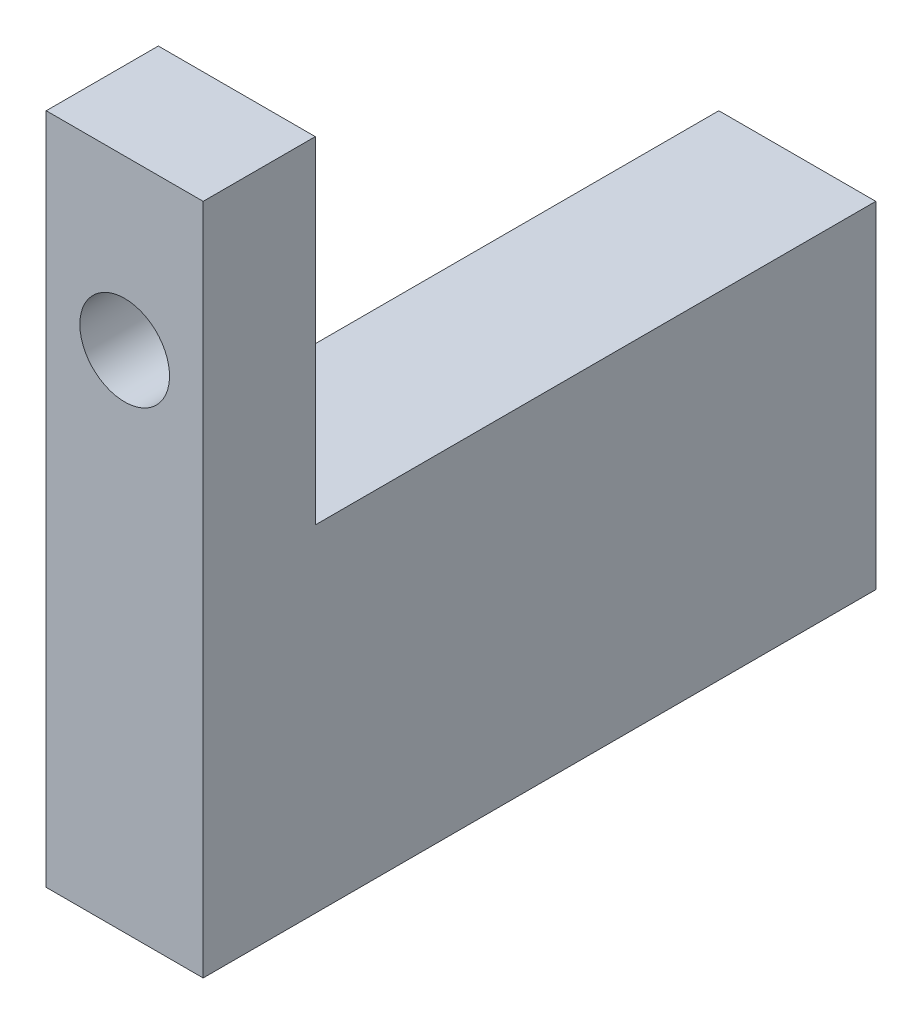
ISO-10303-21;
HEADER;
FILE_DESCRIPTION(('STEP AP214'),'2;1');
FILE_NAME('part.step','',(''),(''),'','','');
FILE_SCHEMA(('AUTOMOTIVE_DESIGN { 1 0 10303 214 1 1 1 1 }'));
ENDSEC;
DATA;
#1=APPLICATION_CONTEXT('core data for automotive mechanical design processes');
#2=APPLICATION_PROTOCOL_DEFINITION('international standard','automotive_design',2000,#1);
#3=PRODUCT_CONTEXT('',#1,'mechanical');
#4=PRODUCT('Part','Part','',(#3));
#5=PRODUCT_RELATED_PRODUCT_CATEGORY('part','',(#4));
#6=PRODUCT_DEFINITION_FORMATION('','',#4);
#7=PRODUCT_DEFINITION_CONTEXT('part definition',#1,'design');
#8=PRODUCT_DEFINITION('design','',#6,#7);
#9=PRODUCT_DEFINITION_SHAPE('','',#8);
#10=(LENGTH_UNIT() NAMED_UNIT(*) SI_UNIT(.MILLI.,.METRE.));
#11=(NAMED_UNIT(*) PLANE_ANGLE_UNIT() SI_UNIT($,.RADIAN.));
#12=(NAMED_UNIT(*) SI_UNIT($,.STERADIAN.) SOLID_ANGLE_UNIT());
#13=UNCERTAINTY_MEASURE_WITH_UNIT(LENGTH_MEASURE(1.E-05),#10,'distance_accuracy_value','');
#14=(GEOMETRIC_REPRESENTATION_CONTEXT(3) GLOBAL_UNCERTAINTY_ASSIGNED_CONTEXT((#13)) GLOBAL_UNIT_ASSIGNED_CONTEXT((#10,
#11,#12)) REPRESENTATION_CONTEXT('',''));
#15=CARTESIAN_POINT('',(0.,0.,0.));
#16=DIRECTION('',(0.,0.,1.));
#17=DIRECTION('',(1.,0.,0.));
#18=AXIS2_PLACEMENT_3D('',#15,#16,#17);
#19=CARTESIAN_POINT('',(7.,30.,0.));
#20=DIRECTION('',(0.,0.,-1.));
#21=DIRECTION('',(0.,1.,0.));
#22=AXIS2_PLACEMENT_3D('',#19,#20,#21);
#23=PLANE('',#22);
#24=CARTESIAN_POINT('',(3.5,22.5,0.));
#25=DIRECTION('',(0.,0.,-1.));
#26=DIRECTION('',(0.,1.,0.));
#27=AXIS2_PLACEMENT_3D('',#24,#25,#26);
#28=CIRCLE('',#27,2.);
#29=CARTESIAN_POINT('',(3.5,24.5,0.));
#30=VERTEX_POINT('',#29);
#31=EDGE_CURVE('E121',#30,#30,#28,.T.);
#32=ORIENTED_EDGE('',*,*,#31,.T.);
#33=EDGE_LOOP('',(#32));
#34=FACE_BOUND('',#33,.T.);
#35=DIRECTION('',(0.,-1.,0.));
#36=VECTOR('',#35,1.);
#37=CARTESIAN_POINT('',(0.,30.,0.));
#38=LINE('',#37,#36);
#39=CARTESIAN_POINT('',(0.,30.,0.));
#40=VERTEX_POINT('',#39);
#41=CARTESIAN_POINT('',(0.,0.,0.));
#42=VERTEX_POINT('',#41);
#43=EDGE_CURVE('E117',#40,#42,#38,.T.);
#44=ORIENTED_EDGE('',*,*,#43,.T.);
#45=DIRECTION('',(-1.,0.,0.));
#46=VECTOR('',#45,1.);
#47=CARTESIAN_POINT('',(7.,0.,0.));
#48=LINE('',#47,#46);
#49=CARTESIAN_POINT('',(7.,0.,0.));
#50=VERTEX_POINT('',#49);
#51=EDGE_CURVE('E11',#50,#42,#48,.T.);
#52=ORIENTED_EDGE('',*,*,#51,.F.);
#53=DIRECTION('',(0.,-1.,0.));
#54=VECTOR('',#53,1.);
#55=CARTESIAN_POINT('',(7.,30.,0.));
#56=LINE('',#55,#54);
#57=CARTESIAN_POINT('',(7.,30.,0.));
#58=VERTEX_POINT('',#57);
#59=EDGE_CURVE('E128',#58,#50,#56,.T.);
#60=ORIENTED_EDGE('',*,*,#59,.F.);
#61=DIRECTION('',(-1.,0.,0.));
#62=VECTOR('',#61,1.);
#63=CARTESIAN_POINT('',(7.,30.,0.));
#64=LINE('',#63,#62);
#65=EDGE_CURVE('E113',#58,#40,#64,.T.);
#66=ORIENTED_EDGE('',*,*,#65,.T.);
#67=EDGE_LOOP('',(#44,#52,#60,#66));
#68=FACE_BOUND('',#67,.T.);
#69=ADVANCED_FACE('F33',(#34,#68),#23,.F.);
#70=CARTESIAN_POINT('',(7.,0.,0.));
#71=DIRECTION('',(0.,1.,0.));
#72=DIRECTION('',(0.,0.,1.));
#73=AXIS2_PLACEMENT_3D('',#70,#71,#72);
#74=PLANE('',#73);
#75=DIRECTION('',(0.,0.,-1.));
#76=VECTOR('',#75,1.);
#77=CARTESIAN_POINT('',(0.,0.,0.));
#78=LINE('',#77,#76);
#79=CARTESIAN_POINT('',(0.,0.,-30.));
#80=VERTEX_POINT('',#79);
#81=EDGE_CURVE('E120',#42,#80,#78,.T.);
#82=ORIENTED_EDGE('',*,*,#81,.T.);
#83=DIRECTION('',(-1.,0.,0.));
#84=VECTOR('',#83,1.);
#85=CARTESIAN_POINT('',(7.,0.,-30.));
#86=LINE('',#85,#84);
#87=CARTESIAN_POINT('',(7.,0.,-30.));
#88=VERTEX_POINT('',#87);
#89=EDGE_CURVE('E41',#88,#80,#86,.T.);
#90=ORIENTED_EDGE('',*,*,#89,.F.);
#91=DIRECTION('',(0.,0.,-1.));
#92=VECTOR('',#91,1.);
#93=CARTESIAN_POINT('',(7.,0.,0.));
#94=LINE('',#93,#92);
#95=EDGE_CURVE('E86',#50,#88,#94,.T.);
#96=ORIENTED_EDGE('',*,*,#95,.F.);
#97=ORIENTED_EDGE('',*,*,#51,.T.);
#98=EDGE_LOOP('',(#82,#90,#96,#97));
#99=FACE_BOUND('',#98,.T.);
#100=ADVANCED_FACE('F153',(#99),#74,.F.);
#101=CARTESIAN_POINT('',(7.,0.,-30.));
#102=DIRECTION('',(0.,0.,1.));
#103=DIRECTION('',(1.,0.,0.));
#104=AXIS2_PLACEMENT_3D('',#101,#102,#103);
#105=PLANE('',#104);
#106=DIRECTION('',(0.,1.,0.));
#107=VECTOR('',#106,1.);
#108=CARTESIAN_POINT('',(0.,0.,-30.));
#109=LINE('',#108,#107);
#110=CARTESIAN_POINT('',(0.,15.,-30.));
#111=VERTEX_POINT('',#110);
#112=EDGE_CURVE('E123',#80,#111,#109,.T.);
#113=ORIENTED_EDGE('',*,*,#112,.T.);
#114=DIRECTION('',(-1.,0.,0.));
#115=VECTOR('',#114,1.);
#116=CARTESIAN_POINT('',(7.,15.,-30.));
#117=LINE('',#116,#115);
#118=CARTESIAN_POINT('',(7.,15.,-30.));
#119=VERTEX_POINT('',#118);
#120=EDGE_CURVE('E108',#119,#111,#117,.T.);
#121=ORIENTED_EDGE('',*,*,#120,.F.);
#122=DIRECTION('',(0.,1.,0.));
#123=VECTOR('',#122,1.);
#124=CARTESIAN_POINT('',(7.,0.,-30.));
#125=LINE('',#124,#123);
#126=EDGE_CURVE('E99',#88,#119,#125,.T.);
#127=ORIENTED_EDGE('',*,*,#126,.F.);
#128=ORIENTED_EDGE('',*,*,#89,.T.);
#129=EDGE_LOOP('',(#113,#121,#127,#128));
#130=FACE_BOUND('',#129,.T.);
#131=ADVANCED_FACE('F134',(#130),#105,.F.);
#132=CARTESIAN_POINT('',(7.,15.,-30.));
#133=DIRECTION('',(0.,-1.,0.));
#134=DIRECTION('',(0.,0.,-1.));
#135=AXIS2_PLACEMENT_3D('',#132,#133,#134);
#136=PLANE('',#135);
#137=DIRECTION('',(0.,0.,1.));
#138=VECTOR('',#137,1.);
#139=CARTESIAN_POINT('',(0.,15.,-30.));
#140=LINE('',#139,#138);
#141=CARTESIAN_POINT('',(0.,15.,-5.));
#142=VERTEX_POINT('',#141);
#143=EDGE_CURVE('E107',#111,#142,#140,.T.);
#144=ORIENTED_EDGE('',*,*,#143,.T.);
#145=DIRECTION('',(-1.,0.,0.));
#146=VECTOR('',#145,1.);
#147=CARTESIAN_POINT('',(7.,15.,-5.));
#148=LINE('',#147,#146);
#149=CARTESIAN_POINT('',(7.,15.,-5.));
#150=VERTEX_POINT('',#149);
#151=EDGE_CURVE('E104',#150,#142,#148,.T.);
#152=ORIENTED_EDGE('',*,*,#151,.F.);
#153=DIRECTION('',(0.,0.,1.));
#154=VECTOR('',#153,1.);
#155=CARTESIAN_POINT('',(7.,15.,-30.));
#156=LINE('',#155,#154);
#157=EDGE_CURVE('E93',#119,#150,#156,.T.);
#158=ORIENTED_EDGE('',*,*,#157,.F.);
#159=ORIENTED_EDGE('',*,*,#120,.T.);
#160=EDGE_LOOP('',(#144,#152,#158,#159));
#161=FACE_BOUND('',#160,.T.);
#162=ADVANCED_FACE('F105',(#161),#136,.F.);
#163=CARTESIAN_POINT('',(7.,15.,-5.));
#164=DIRECTION('',(0.,0.,1.));
#165=DIRECTION('',(1.,0.,0.));
#166=AXIS2_PLACEMENT_3D('',#163,#164,#165);
#167=PLANE('',#166);
#168=CARTESIAN_POINT('',(3.5,22.5,-5.));
#169=DIRECTION('',(0.,0.,-1.));
#170=DIRECTION('',(-1.,0.,0.));
#171=AXIS2_PLACEMENT_3D('',#168,#169,#170);
#172=CIRCLE('',#171,2.);
#173=CARTESIAN_POINT('',(1.5,22.5,-5.));
#174=VERTEX_POINT('',#173);
#175=EDGE_CURVE('E161',#174,#174,#172,.T.);
#176=ORIENTED_EDGE('',*,*,#175,.F.);
#177=EDGE_LOOP('',(#176));
#178=FACE_BOUND('',#177,.T.);
#179=DIRECTION('',(0.,1.,0.));
#180=VECTOR('',#179,1.);
#181=CARTESIAN_POINT('',(0.,15.,-5.));
#182=LINE('',#181,#180);
#183=CARTESIAN_POINT('',(0.,30.,-5.));
#184=VERTEX_POINT('',#183);
#185=EDGE_CURVE('E72',#142,#184,#182,.T.);
#186=ORIENTED_EDGE('',*,*,#185,.T.);
#187=DIRECTION('',(-1.,0.,0.));
#188=VECTOR('',#187,1.);
#189=CARTESIAN_POINT('',(7.,30.,-5.));
#190=LINE('',#189,#188);
#191=CARTESIAN_POINT('',(7.,30.,-5.));
#192=VERTEX_POINT('',#191);
#193=EDGE_CURVE('E109',#192,#184,#190,.T.);
#194=ORIENTED_EDGE('',*,*,#193,.F.);
#195=DIRECTION('',(0.,1.,0.));
#196=VECTOR('',#195,1.);
#197=CARTESIAN_POINT('',(7.,15.,-5.));
#198=LINE('',#197,#196);
#199=EDGE_CURVE('E97',#150,#192,#198,.T.);
#200=ORIENTED_EDGE('',*,*,#199,.F.);
#201=ORIENTED_EDGE('',*,*,#151,.T.);
#202=EDGE_LOOP('',(#186,#194,#200,#201));
#203=FACE_BOUND('',#202,.T.);
#204=ADVANCED_FACE('F111',(#178,#203),#167,.F.);
#205=CARTESIAN_POINT('',(7.,30.,-5.));
#206=DIRECTION('',(0.,-1.,0.));
#207=DIRECTION('',(0.,0.,-1.));
#208=AXIS2_PLACEMENT_3D('',#205,#206,#207);
#209=PLANE('',#208);
#210=DIRECTION('',(0.,0.,1.));
#211=VECTOR('',#210,1.);
#212=CARTESIAN_POINT('',(0.,30.,-5.));
#213=LINE('',#212,#211);
#214=EDGE_CURVE('E78',#184,#40,#213,.T.);
#215=ORIENTED_EDGE('',*,*,#214,.T.);
#216=ORIENTED_EDGE('',*,*,#65,.F.);
#217=DIRECTION('',(0.,0.,1.));
#218=VECTOR('',#217,1.);
#219=CARTESIAN_POINT('',(7.,30.,-5.));
#220=LINE('',#219,#218);
#221=EDGE_CURVE('E49',#192,#58,#220,.T.);
#222=ORIENTED_EDGE('',*,*,#221,.F.);
#223=ORIENTED_EDGE('',*,*,#193,.T.);
#224=EDGE_LOOP('',(#215,#216,#222,#223));
#225=FACE_BOUND('',#224,.T.);
#226=ADVANCED_FACE('F141',(#225),#209,.F.);
#227=CARTESIAN_POINT('',(7.,0.,0.));
#228=DIRECTION('',(1.,0.,0.));
#229=DIRECTION('',(0.,0.,-1.));
#230=AXIS2_PLACEMENT_3D('',#227,#228,#229);
#231=PLANE('',#230);
#232=ORIENTED_EDGE('',*,*,#59,.T.);
#233=ORIENTED_EDGE('',*,*,#95,.T.);
#234=ORIENTED_EDGE('',*,*,#126,.T.);
#235=ORIENTED_EDGE('',*,*,#157,.T.);
#236=ORIENTED_EDGE('',*,*,#199,.T.);
#237=ORIENTED_EDGE('',*,*,#221,.T.);
#238=EDGE_LOOP('',(#232,#233,#234,#235,#236,#237));
#239=FACE_BOUND('',#238,.T.);
#240=ADVANCED_FACE('F95',(#239),#231,.T.);
#241=CARTESIAN_POINT('',(0.,0.,0.));
#242=DIRECTION('',(1.,0.,0.));
#243=DIRECTION('',(0.,0.,-1.));
#244=AXIS2_PLACEMENT_3D('',#241,#242,#243);
#245=PLANE('',#244);
#246=ORIENTED_EDGE('',*,*,#43,.F.);
#247=ORIENTED_EDGE('',*,*,#214,.F.);
#248=ORIENTED_EDGE('',*,*,#185,.F.);
#249=ORIENTED_EDGE('',*,*,#143,.F.);
#250=ORIENTED_EDGE('',*,*,#112,.F.);
#251=ORIENTED_EDGE('',*,*,#81,.F.);
#252=EDGE_LOOP('',(#246,#247,#248,#249,#250,#251));
#253=FACE_BOUND('',#252,.T.);
#254=ADVANCED_FACE('F137',(#253),#245,.F.);
#255=CARTESIAN_POINT('',(3.5,22.5,2.));
#256=DIRECTION('',(0.,0.,-1.));
#257=DIRECTION('',(-1.,0.,0.));
#258=AXIS2_PLACEMENT_3D('',#255,#256,#257);
#259=CYLINDRICAL_SURFACE('',#258,2.);
#260=ORIENTED_EDGE('',*,*,#175,.T.);
#261=EDGE_LOOP('',(#260));
#262=FACE_BOUND('',#261,.T.);
#263=ORIENTED_EDGE('',*,*,#31,.F.);
#264=EDGE_LOOP('',(#263));
#265=FACE_BOUND('',#264,.T.);
#266=ADVANCED_FACE('F169',(#262,#265),#259,.F.);
#267=CLOSED_SHELL('',(#69,#100,#131,#162,#204,#226,#240,#254,#266));
#268=MANIFOLD_SOLID_BREP('B2',#267);
#269=ADVANCED_BREP_SHAPE_REPRESENTATION('',(#18,#268),#14);
#270=SHAPE_DEFINITION_REPRESENTATION(#9,#269);
ENDSEC;
END-ISO-10303-21;
